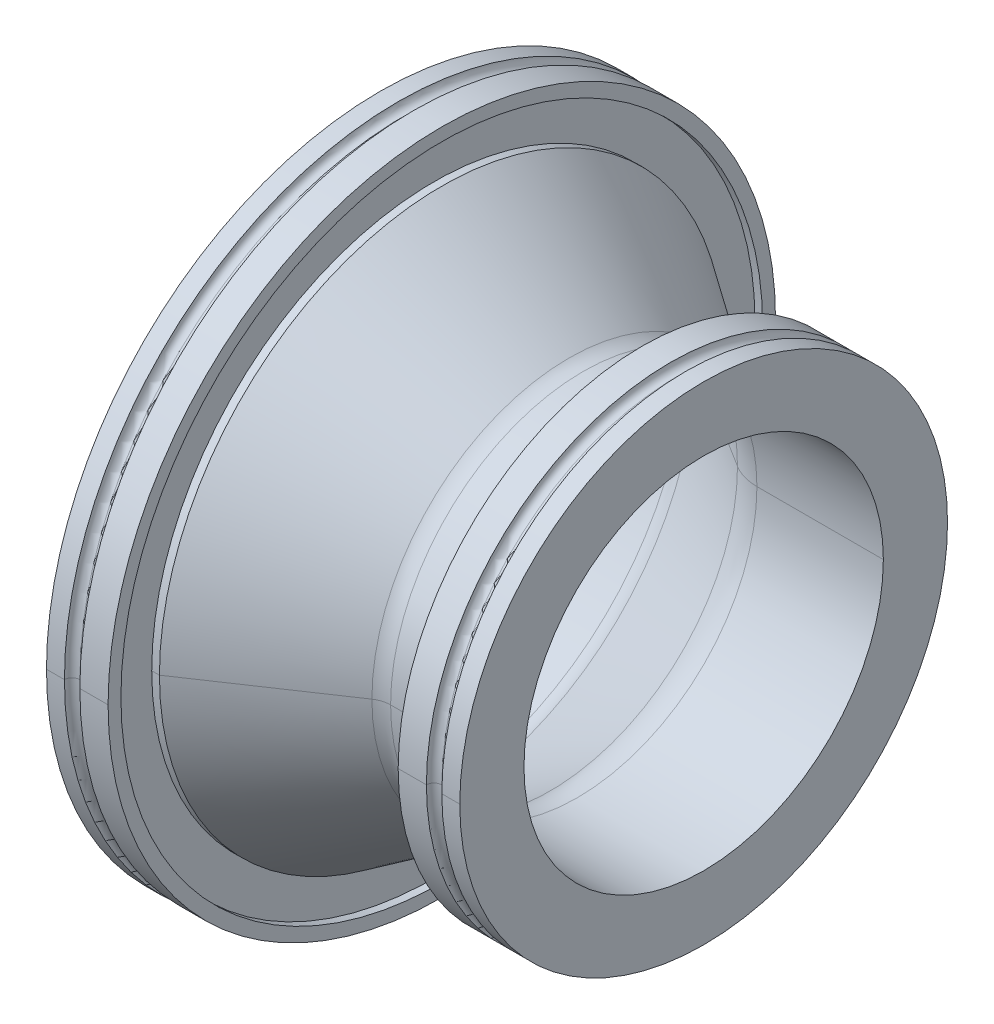
ISO-10303-21;
HEADER;
FILE_DESCRIPTION(('STEP AP214'),'2;1');
FILE_NAME('part.step','',(''),(''),'','','');
FILE_SCHEMA(('AUTOMOTIVE_DESIGN { 1 0 10303 214 1 1 1 1 }'));
ENDSEC;
DATA;
#1=APPLICATION_CONTEXT('core data for automotive mechanical design processes');
#2=APPLICATION_PROTOCOL_DEFINITION('international standard','automotive_design',2000,#1);
#3=PRODUCT_CONTEXT('',#1,'mechanical');
#4=PRODUCT('Part','Part','',(#3));
#5=PRODUCT_RELATED_PRODUCT_CATEGORY('part','',(#4));
#6=PRODUCT_DEFINITION_FORMATION('','',#4);
#7=PRODUCT_DEFINITION_CONTEXT('part definition',#1,'design');
#8=PRODUCT_DEFINITION('design','',#6,#7);
#9=PRODUCT_DEFINITION_SHAPE('','',#8);
#10=(LENGTH_UNIT() NAMED_UNIT(*) SI_UNIT(.MILLI.,.METRE.));
#11=(NAMED_UNIT(*) PLANE_ANGLE_UNIT() SI_UNIT($,.RADIAN.));
#12=(NAMED_UNIT(*) SI_UNIT($,.STERADIAN.) SOLID_ANGLE_UNIT());
#13=UNCERTAINTY_MEASURE_WITH_UNIT(LENGTH_MEASURE(1.E-05),#10,'distance_accuracy_value','');
#14=(GEOMETRIC_REPRESENTATION_CONTEXT(3) GLOBAL_UNCERTAINTY_ASSIGNED_CONTEXT((#13)) GLOBAL_UNIT_ASSIGNED_CONTEXT((#10,
#11,#12)) REPRESENTATION_CONTEXT('',''));
#15=CARTESIAN_POINT('',(0.,0.,0.));
#16=DIRECTION('',(0.,0.,1.));
#17=DIRECTION('',(1.,0.,0.));
#18=AXIS2_PLACEMENT_3D('',#15,#16,#17);
#19=CARTESIAN_POINT('',(11.2187095906382,0.,0.));
#20=DIRECTION('',(-1.,0.,0.));
#21=DIRECTION('',(0.,0.,1.));
#22=AXIS2_PLACEMENT_3D('',#19,#20,#21);
#23=CONICAL_SURFACE('',#22,50.2353194725407,0.560359876904843);
#24=DIRECTION('',(-0.847063894508148,0.,-0.531491071063936));
#25=VECTOR('',#24,1.);
#26=CARTESIAN_POINT('',(11.2187095906382,0.,-50.2353194725407));
#27=LINE('',#26,#25);
#28=CARTESIAN_POINT('',(33.0625808187235,0.,-36.5293610549186));
#29=VERTEX_POINT('',#28);
#30=CARTESIAN_POINT('',(11.2187095906382,0.,-50.2353194725407));
#31=VERTEX_POINT('',#30);
#32=EDGE_CURVE('E405',#29,#31,#27,.T.);
#33=ORIENTED_EDGE('',*,*,#32,.F.);
#34=CARTESIAN_POINT('',(33.0625808187235,0.,0.));
#35=DIRECTION('',(-1.,0.,0.));
#36=DIRECTION('',(0.,0.,1.));
#37=AXIS2_PLACEMENT_3D('',#34,#35,#36);
#38=CIRCLE('',#37,36.5293610549186);
#39=CARTESIAN_POINT('',(33.0625808187235,0.,36.5293610549186));
#40=VERTEX_POINT('',#39);
#41=EDGE_CURVE('E411',#40,#29,#38,.T.);
#42=ORIENTED_EDGE('',*,*,#41,.F.);
#43=DIRECTION('',(-0.847063894508148,0.,0.531491071063936));
#44=VECTOR('',#43,1.);
#45=CARTESIAN_POINT('',(11.2187095906382,0.,50.2353194725407));
#46=LINE('',#45,#44);
#47=CARTESIAN_POINT('',(11.2187095906382,0.,50.2353194725407));
#48=VERTEX_POINT('',#47);
#49=EDGE_CURVE('E21',#40,#48,#46,.T.);
#50=ORIENTED_EDGE('',*,*,#49,.T.);
#51=CARTESIAN_POINT('',(11.2187095906382,0.,0.));
#52=DIRECTION('',(-1.,0.,0.));
#53=DIRECTION('',(0.,0.,1.));
#54=AXIS2_PLACEMENT_3D('',#51,#52,#53);
#55=CIRCLE('',#54,50.2353194725407);
#56=EDGE_CURVE('E11',#48,#31,#55,.T.);
#57=ORIENTED_EDGE('',*,*,#56,.T.);
#58=EDGE_LOOP('',(#33,#42,#50,#57));
#59=FACE_BOUND('',#58,.T.);
#60=ADVANCED_FACE('F17',(#59),#23,.F.);
#61=CARTESIAN_POINT('',(8.56125423531852,0.,0.));
#62=DIRECTION('',(-1.,0.,0.));
#63=DIRECTION('',(0.,0.,1.));
#64=AXIS2_PLACEMENT_3D('',#61,#62,#63);
#65=TOROIDAL_SURFACE('',#64,46.,5.);
#66=CARTESIAN_POINT('',(8.56125423531852,0.,-46.));
#67=DIRECTION('',(0.,1.,0.));
#68=DIRECTION('',(0.,0.,1.));
#69=AXIS2_PLACEMENT_3D('',#66,#67,#68);
#70=CIRCLE('',#69,5.);
#71=CARTESIAN_POINT('',(8.5612542353185,0.,-51.));
#72=VERTEX_POINT('',#71);
#73=EDGE_CURVE('E286',#31,#72,#70,.T.);
#74=ORIENTED_EDGE('',*,*,#73,.F.);
#75=ORIENTED_EDGE('',*,*,#56,.F.);
#76=CARTESIAN_POINT('',(8.56125423531852,0.,46.));
#77=DIRECTION('',(0.,-1.,0.));
#78=DIRECTION('',(0.,0.,-1.));
#79=AXIS2_PLACEMENT_3D('',#76,#77,#78);
#80=CIRCLE('',#79,5.);
#81=CARTESIAN_POINT('',(8.5612542353185,0.,51.));
#82=VERTEX_POINT('',#81);
#83=EDGE_CURVE('E285',#48,#82,#80,.T.);
#84=ORIENTED_EDGE('',*,*,#83,.T.);
#85=CARTESIAN_POINT('',(8.5612542353185,0.,0.));
#86=DIRECTION('',(-1.,0.,0.));
#87=DIRECTION('',(0.,0.,1.));
#88=AXIS2_PLACEMENT_3D('',#85,#86,#87);
#89=CIRCLE('',#88,51.);
#90=EDGE_CURVE('E28',#82,#72,#89,.T.);
#91=ORIENTED_EDGE('',*,*,#90,.T.);
#92=EDGE_LOOP('',(#74,#75,#84,#91));
#93=FACE_BOUND('',#92,.T.);
#94=ADVANCED_FACE('F650',(#93),#65,.F.);
#95=CARTESIAN_POINT('',(0.,0.,0.));
#96=DIRECTION('',(-1.,0.,0.));
#97=DIRECTION('',(0.,0.,1.));
#98=AXIS2_PLACEMENT_3D('',#95,#96,#97);
#99=CYLINDRICAL_SURFACE('',#98,51.);
#100=DIRECTION('',(-1.,0.,0.));
#101=VECTOR('',#100,1.);
#102=CARTESIAN_POINT('',(0.,0.,-51.));
#103=LINE('',#102,#101);
#104=CARTESIAN_POINT('',(0.,0.,-51.));
#105=VERTEX_POINT('',#104);
#106=EDGE_CURVE('E301',#72,#105,#103,.T.);
#107=ORIENTED_EDGE('',*,*,#106,.F.);
#108=ORIENTED_EDGE('',*,*,#90,.F.);
#109=DIRECTION('',(-1.,0.,0.));
#110=VECTOR('',#109,1.);
#111=CARTESIAN_POINT('',(0.,0.,51.));
#112=LINE('',#111,#110);
#113=CARTESIAN_POINT('',(0.,0.,51.));
#114=VERTEX_POINT('',#113);
#115=EDGE_CURVE('E300',#82,#114,#112,.T.);
#116=ORIENTED_EDGE('',*,*,#115,.T.);
#117=CARTESIAN_POINT('',(0.,0.,0.));
#118=DIRECTION('',(-1.,0.,0.));
#119=DIRECTION('',(0.,0.,1.));
#120=AXIS2_PLACEMENT_3D('',#117,#118,#119);
#121=CIRCLE('',#120,51.);
#122=EDGE_CURVE('E421',#114,#105,#121,.T.);
#123=ORIENTED_EDGE('',*,*,#122,.T.);
#124=EDGE_LOOP('',(#107,#108,#116,#123));
#125=FACE_BOUND('',#124,.T.);
#126=ADVANCED_FACE('F518',(#125),#99,.F.);
#127=CARTESIAN_POINT('',(0.,0.,0.));
#128=DIRECTION('',(-1.,0.,0.));
#129=DIRECTION('',(0.,0.,1.));
#130=AXIS2_PLACEMENT_3D('',#127,#128,#129);
#131=PLANE('',#130);
#132=ORIENTED_EDGE('',*,*,#122,.F.);
#133=CARTESIAN_POINT('',(0.,0.,0.));
#134=DIRECTION('',(-1.,0.,0.));
#135=DIRECTION('',(0.,0.,1.));
#136=AXIS2_PLACEMENT_3D('',#133,#134,#135);
#137=CIRCLE('',#136,51.);
#138=EDGE_CURVE('E296',#105,#114,#137,.T.);
#139=ORIENTED_EDGE('',*,*,#138,.F.);
#140=EDGE_LOOP('',(#132,#139));
#141=FACE_BOUND('',#140,.T.);
#142=CARTESIAN_POINT('',(0.,0.,0.));
#143=DIRECTION('',(-1.,0.,0.));
#144=DIRECTION('',(0.,0.,1.));
#145=AXIS2_PLACEMENT_3D('',#142,#143,#144);
#146=CIRCLE('',#145,65.);
#147=CARTESIAN_POINT('',(0.,0.,65.));
#148=VERTEX_POINT('',#147);
#149=CARTESIAN_POINT('',(0.,0.,-65.));
#150=VERTEX_POINT('',#149);
#151=EDGE_CURVE('E528',#148,#150,#146,.T.);
#152=ORIENTED_EDGE('',*,*,#151,.T.);
#153=CARTESIAN_POINT('',(0.,0.,0.));
#154=DIRECTION('',(-1.,0.,0.));
#155=DIRECTION('',(0.,0.,1.));
#156=AXIS2_PLACEMENT_3D('',#153,#154,#155);
#157=CIRCLE('',#156,65.);
#158=EDGE_CURVE('E338',#150,#148,#157,.T.);
#159=ORIENTED_EDGE('',*,*,#158,.T.);
#160=EDGE_LOOP('',(#152,#159));
#161=FACE_BOUND('',#160,.T.);
#162=ADVANCED_FACE('F521',(#141,#161),#131,.T.);
#163=CARTESIAN_POINT('',(0.,0.,0.));
#164=DIRECTION('',(-1.,0.,0.));
#165=DIRECTION('',(0.,0.,1.));
#166=AXIS2_PLACEMENT_3D('',#163,#164,#165);
#167=CYLINDRICAL_SURFACE('',#166,65.);
#168=DIRECTION('',(-1.,0.,0.));
#169=VECTOR('',#168,1.);
#170=CARTESIAN_POINT('',(0.,0.,-65.));
#171=LINE('',#170,#169);
#172=CARTESIAN_POINT('',(3.5,0.,-65.));
#173=VERTEX_POINT('',#172);
#174=EDGE_CURVE('E342',#173,#150,#171,.T.);
#175=ORIENTED_EDGE('',*,*,#174,.F.);
#176=CARTESIAN_POINT('',(3.5,0.,0.));
#177=DIRECTION('',(-1.,0.,0.));
#178=DIRECTION('',(0.,0.,1.));
#179=AXIS2_PLACEMENT_3D('',#176,#177,#178);
#180=CIRCLE('',#179,65.);
#181=CARTESIAN_POINT('',(3.5,0.,65.));
#182=VERTEX_POINT('',#181);
#183=EDGE_CURVE('E446',#173,#182,#180,.T.);
#184=ORIENTED_EDGE('',*,*,#183,.T.);
#185=DIRECTION('',(-1.,0.,0.));
#186=VECTOR('',#185,1.);
#187=CARTESIAN_POINT('',(0.,0.,65.));
#188=LINE('',#187,#186);
#189=EDGE_CURVE('E386',#182,#148,#188,.T.);
#190=ORIENTED_EDGE('',*,*,#189,.T.);
#191=ORIENTED_EDGE('',*,*,#158,.F.);
#192=EDGE_LOOP('',(#175,#184,#190,#191));
#193=FACE_BOUND('',#192,.T.);
#194=ADVANCED_FACE('F524',(#193),#167,.T.);
#195=CARTESIAN_POINT('',(5.,0.,0.));
#196=DIRECTION('',(-1.,0.,0.));
#197=DIRECTION('',(0.,0.,1.));
#198=AXIS2_PLACEMENT_3D('',#195,#196,#197);
#199=TOROIDAL_SURFACE('',#198,65.,1.5);
#200=CARTESIAN_POINT('',(5.,0.,0.));
#201=DIRECTION('',(-1.,0.,0.));
#202=DIRECTION('',(0.,0.,1.));
#203=AXIS2_PLACEMENT_3D('',#200,#201,#202);
#204=CIRCLE('',#203,63.5);
#205=CARTESIAN_POINT('',(5.,0.,63.5));
#206=VERTEX_POINT('',#205);
#207=CARTESIAN_POINT('',(5.,0.,-63.5));
#208=VERTEX_POINT('',#207);
#209=EDGE_CURVE('E287',#206,#208,#204,.T.);
#210=ORIENTED_EDGE('',*,*,#209,.F.);
#211=CARTESIAN_POINT('',(5.,0.,65.));
#212=DIRECTION('',(0.,-1.,0.));
#213=DIRECTION('',(0.,0.,-1.));
#214=AXIS2_PLACEMENT_3D('',#211,#212,#213);
#215=CIRCLE('',#214,1.5);
#216=CARTESIAN_POINT('',(6.5,0.,65.));
#217=VERTEX_POINT('',#216);
#218=EDGE_CURVE('E393',#206,#217,#215,.T.);
#219=ORIENTED_EDGE('',*,*,#218,.T.);
#220=CARTESIAN_POINT('',(6.5,0.,0.));
#221=DIRECTION('',(-1.,0.,0.));
#222=DIRECTION('',(0.,0.,1.));
#223=AXIS2_PLACEMENT_3D('',#220,#221,#222);
#224=CIRCLE('',#223,65.);
#225=CARTESIAN_POINT('',(6.5,0.,-65.));
#226=VERTEX_POINT('',#225);
#227=EDGE_CURVE('E315',#217,#226,#224,.T.);
#228=ORIENTED_EDGE('',*,*,#227,.T.);
#229=CARTESIAN_POINT('',(5.,0.,-65.));
#230=DIRECTION('',(0.,1.,0.));
#231=DIRECTION('',(0.,0.,1.));
#232=AXIS2_PLACEMENT_3D('',#229,#230,#231);
#233=CIRCLE('',#232,1.5);
#234=EDGE_CURVE('E394',#208,#226,#233,.T.);
#235=ORIENTED_EDGE('',*,*,#234,.F.);
#236=EDGE_LOOP('',(#210,#219,#228,#235));
#237=FACE_BOUND('',#236,.T.);
#238=ADVANCED_FACE('F679',(#237),#199,.F.);
#239=CARTESIAN_POINT('',(0.,0.,0.));
#240=DIRECTION('',(-1.,0.,0.));
#241=DIRECTION('',(0.,0.,1.));
#242=AXIS2_PLACEMENT_3D('',#239,#240,#241);
#243=CYLINDRICAL_SURFACE('',#242,65.);
#244=DIRECTION('',(-1.,0.,0.));
#245=VECTOR('',#244,1.);
#246=CARTESIAN_POINT('',(0.,0.,-65.));
#247=LINE('',#246,#245);
#248=CARTESIAN_POINT('',(12.,0.,-65.));
#249=VERTEX_POINT('',#248);
#250=EDGE_CURVE('E345',#249,#226,#247,.T.);
#251=ORIENTED_EDGE('',*,*,#250,.F.);
#252=CARTESIAN_POINT('',(12.,0.,0.));
#253=DIRECTION('',(-1.,0.,0.));
#254=DIRECTION('',(0.,0.,1.));
#255=AXIS2_PLACEMENT_3D('',#252,#253,#254);
#256=CIRCLE('',#255,65.);
#257=CARTESIAN_POINT('',(12.,0.,65.));
#258=VERTEX_POINT('',#257);
#259=EDGE_CURVE('E335',#249,#258,#256,.T.);
#260=ORIENTED_EDGE('',*,*,#259,.T.);
#261=DIRECTION('',(-1.,0.,0.));
#262=VECTOR('',#261,1.);
#263=CARTESIAN_POINT('',(0.,0.,65.));
#264=LINE('',#263,#262);
#265=EDGE_CURVE('E307',#258,#217,#264,.T.);
#266=ORIENTED_EDGE('',*,*,#265,.T.);
#267=CARTESIAN_POINT('',(6.5,0.,0.));
#268=DIRECTION('',(-1.,0.,0.));
#269=DIRECTION('',(0.,0.,1.));
#270=AXIS2_PLACEMENT_3D('',#267,#268,#269);
#271=CIRCLE('',#270,65.);
#272=EDGE_CURVE('E390',#226,#217,#271,.T.);
#273=ORIENTED_EDGE('',*,*,#272,.F.);
#274=EDGE_LOOP('',(#251,#260,#266,#273));
#275=FACE_BOUND('',#274,.T.);
#276=ADVANCED_FACE('F727',(#275),#243,.T.);
#277=CARTESIAN_POINT('',(12.,0.,0.));
#278=DIRECTION('',(1.,0.,0.));
#279=DIRECTION('',(0.,1.,0.));
#280=AXIS2_PLACEMENT_3D('',#277,#278,#279);
#281=PLANE('',#280);
#282=CARTESIAN_POINT('',(12.,0.,0.));
#283=DIRECTION('',(-1.,0.,0.));
#284=DIRECTION('',(0.,0.,1.));
#285=AXIS2_PLACEMENT_3D('',#282,#283,#284);
#286=CIRCLE('',#285,62.5);
#287=CARTESIAN_POINT('',(12.,0.,62.5));
#288=VERTEX_POINT('',#287);
#289=CARTESIAN_POINT('',(12.,0.,-62.5));
#290=VERTEX_POINT('',#289);
#291=EDGE_CURVE('E118',#288,#290,#286,.T.);
#292=ORIENTED_EDGE('',*,*,#291,.T.);
#293=CARTESIAN_POINT('',(12.,0.,0.));
#294=DIRECTION('',(-1.,0.,0.));
#295=DIRECTION('',(0.,0.,1.));
#296=AXIS2_PLACEMENT_3D('',#293,#294,#295);
#297=CIRCLE('',#296,62.5);
#298=EDGE_CURVE('E302',#290,#288,#297,.T.);
#299=ORIENTED_EDGE('',*,*,#298,.T.);
#300=EDGE_LOOP('',(#292,#299));
#301=FACE_BOUND('',#300,.T.);
#302=CARTESIAN_POINT('',(12.,0.,0.));
#303=DIRECTION('',(-1.,0.,0.));
#304=DIRECTION('',(0.,0.,1.));
#305=AXIS2_PLACEMENT_3D('',#302,#303,#304);
#306=CIRCLE('',#305,65.);
#307=EDGE_CURVE('E459',#258,#249,#306,.T.);
#308=ORIENTED_EDGE('',*,*,#307,.F.);
#309=ORIENTED_EDGE('',*,*,#259,.F.);
#310=EDGE_LOOP('',(#308,#309));
#311=FACE_BOUND('',#310,.T.);
#312=ADVANCED_FACE('F730',(#301,#311),#281,.T.);
#313=CARTESIAN_POINT('',(0.,0.,0.));
#314=DIRECTION('',(-1.,0.,0.));
#315=DIRECTION('',(0.,0.,1.));
#316=AXIS2_PLACEMENT_3D('',#313,#314,#315);
#317=CYLINDRICAL_SURFACE('',#316,62.5);
#318=DIRECTION('',(-1.,0.,0.));
#319=VECTOR('',#318,1.);
#320=CARTESIAN_POINT('',(0.,0.,-62.5));
#321=LINE('',#320,#319);
#322=CARTESIAN_POINT('',(10.5,0.,-62.5));
#323=VERTEX_POINT('',#322);
#324=EDGE_CURVE('E306',#290,#323,#321,.T.);
#325=ORIENTED_EDGE('',*,*,#324,.F.);
#326=ORIENTED_EDGE('',*,*,#291,.F.);
#327=DIRECTION('',(-1.,0.,0.));
#328=VECTOR('',#327,1.);
#329=CARTESIAN_POINT('',(0.,0.,62.5));
#330=LINE('',#329,#328);
#331=CARTESIAN_POINT('',(10.5,0.,62.5));
#332=VERTEX_POINT('',#331);
#333=EDGE_CURVE('E478',#288,#332,#330,.T.);
#334=ORIENTED_EDGE('',*,*,#333,.T.);
#335=CARTESIAN_POINT('',(10.5,0.,0.));
#336=DIRECTION('',(-1.,0.,0.));
#337=DIRECTION('',(0.,0.,1.));
#338=AXIS2_PLACEMENT_3D('',#335,#336,#337);
#339=CIRCLE('',#338,62.5);
#340=EDGE_CURVE('E106',#332,#323,#339,.T.);
#341=ORIENTED_EDGE('',*,*,#340,.T.);
#342=EDGE_LOOP('',(#325,#326,#334,#341));
#343=FACE_BOUND('',#342,.T.);
#344=ADVANCED_FACE('F707',(#343),#317,.F.);
#345=CARTESIAN_POINT('',(10.5,0.,0.));
#346=DIRECTION('',(1.,0.,0.));
#347=DIRECTION('',(0.,1.,0.));
#348=AXIS2_PLACEMENT_3D('',#345,#346,#347);
#349=PLANE('',#348);
#350=CARTESIAN_POINT('',(10.5,0.,0.));
#351=DIRECTION('',(-1.,0.,0.));
#352=DIRECTION('',(0.,0.,1.));
#353=AXIS2_PLACEMENT_3D('',#350,#351,#352);
#354=CIRCLE('',#353,55.);
#355=CARTESIAN_POINT('',(10.5,0.,55.));
#356=VERTEX_POINT('',#355);
#357=CARTESIAN_POINT('',(10.5,0.,-55.));
#358=VERTEX_POINT('',#357);
#359=EDGE_CURVE('E312',#356,#358,#354,.T.);
#360=ORIENTED_EDGE('',*,*,#359,.T.);
#361=CARTESIAN_POINT('',(10.5,0.,0.));
#362=DIRECTION('',(-1.,0.,0.));
#363=DIRECTION('',(0.,0.,1.));
#364=AXIS2_PLACEMENT_3D('',#361,#362,#363);
#365=CIRCLE('',#364,55.);
#366=EDGE_CURVE('E418',#358,#356,#365,.T.);
#367=ORIENTED_EDGE('',*,*,#366,.T.);
#368=EDGE_LOOP('',(#360,#367));
#369=FACE_BOUND('',#368,.T.);
#370=ORIENTED_EDGE('',*,*,#340,.F.);
#371=CARTESIAN_POINT('',(10.5,0.,0.));
#372=DIRECTION('',(-1.,0.,0.));
#373=DIRECTION('',(0.,0.,1.));
#374=AXIS2_PLACEMENT_3D('',#371,#372,#373);
#375=CIRCLE('',#374,62.5);
#376=EDGE_CURVE('E436',#323,#332,#375,.T.);
#377=ORIENTED_EDGE('',*,*,#376,.F.);
#378=EDGE_LOOP('',(#370,#377));
#379=FACE_BOUND('',#378,.T.);
#380=ADVANCED_FACE('F672',(#369,#379),#349,.T.);
#381=CARTESIAN_POINT('',(0.,0.,0.));
#382=DIRECTION('',(-1.,0.,0.));
#383=DIRECTION('',(0.,0.,1.));
#384=AXIS2_PLACEMENT_3D('',#381,#382,#383);
#385=CYLINDRICAL_SURFACE('',#384,55.);
#386=DIRECTION('',(-1.,0.,0.));
#387=VECTOR('',#386,1.);
#388=CARTESIAN_POINT('',(0.,0.,-55.));
#389=LINE('',#388,#387);
#390=CARTESIAN_POINT('',(12.,0.,-55.));
#391=VERTEX_POINT('',#390);
#392=EDGE_CURVE('E308',#391,#358,#389,.T.);
#393=ORIENTED_EDGE('',*,*,#392,.F.);
#394=CARTESIAN_POINT('',(12.,0.,0.));
#395=DIRECTION('',(-1.,0.,0.));
#396=DIRECTION('',(0.,0.,1.));
#397=AXIS2_PLACEMENT_3D('',#394,#395,#396);
#398=CIRCLE('',#397,55.);
#399=CARTESIAN_POINT('',(12.,0.,55.));
#400=VERTEX_POINT('',#399);
#401=EDGE_CURVE('E442',#391,#400,#398,.T.);
#402=ORIENTED_EDGE('',*,*,#401,.T.);
#403=DIRECTION('',(-1.,0.,0.));
#404=VECTOR('',#403,1.);
#405=CARTESIAN_POINT('',(0.,0.,55.));
#406=LINE('',#405,#404);
#407=EDGE_CURVE('E280',#400,#356,#406,.T.);
#408=ORIENTED_EDGE('',*,*,#407,.T.);
#409=ORIENTED_EDGE('',*,*,#366,.F.);
#410=EDGE_LOOP('',(#393,#402,#408,#409));
#411=FACE_BOUND('',#410,.T.);
#412=ADVANCED_FACE('F668',(#411),#385,.T.);
#413=CARTESIAN_POINT('',(12.,0.,0.));
#414=DIRECTION('',(-1.,0.,0.));
#415=DIRECTION('',(0.,0.,1.));
#416=AXIS2_PLACEMENT_3D('',#413,#414,#415);
#417=CONICAL_SURFACE('',#416,55.,0.592427353431879);
#418=DIRECTION('',(-0.829587747619415,0.,-0.558376368589991));
#419=VECTOR('',#418,1.);
#420=CARTESIAN_POINT('',(12.,0.,-55.));
#421=LINE('',#420,#419);
#422=CARTESIAN_POINT('',(36.734080410887,0.,-38.352061261903));
#423=VERTEX_POINT('',#422);
#424=EDGE_CURVE('E351',#423,#391,#421,.T.);
#425=ORIENTED_EDGE('',*,*,#424,.F.);
#426=CARTESIAN_POINT('',(36.734080410887,0.,0.));
#427=DIRECTION('',(-1.,0.,0.));
#428=DIRECTION('',(0.,0.,1.));
#429=AXIS2_PLACEMENT_3D('',#426,#427,#428);
#430=CIRCLE('',#429,38.352061261903);
#431=CARTESIAN_POINT('',(36.734080410887,0.,38.352061261903));
#432=VERTEX_POINT('',#431);
#433=EDGE_CURVE('E350',#423,#432,#430,.T.);
#434=ORIENTED_EDGE('',*,*,#433,.T.);
#435=DIRECTION('',(-0.829587747619415,0.,0.558376368589991));
#436=VECTOR('',#435,1.);
#437=CARTESIAN_POINT('',(12.,0.,55.));
#438=LINE('',#437,#436);
#439=EDGE_CURVE('E346',#432,#400,#438,.T.);
#440=ORIENTED_EDGE('',*,*,#439,.T.);
#441=ORIENTED_EDGE('',*,*,#401,.F.);
#442=EDGE_LOOP('',(#425,#434,#440,#441));
#443=FACE_BOUND('',#442,.T.);
#444=ADVANCED_FACE('F671',(#443),#417,.T.);
#445=CARTESIAN_POINT('',(39.5259622538371,0.,0.));
#446=DIRECTION('',(-1.,0.,0.));
#447=DIRECTION('',(0.,0.,1.));
#448=AXIS2_PLACEMENT_3D('',#445,#446,#447);
#449=TOROIDAL_SURFACE('',#448,42.5,5.);
#450=CARTESIAN_POINT('',(39.5259622538371,0.,-42.5));
#451=DIRECTION('',(0.,1.,0.));
#452=DIRECTION('',(0.,0.,1.));
#453=AXIS2_PLACEMENT_3D('',#450,#451,#452);
#454=CIRCLE('',#453,5.);
#455=CARTESIAN_POINT('',(39.5259622538371,0.,-37.5));
#456=VERTEX_POINT('',#455);
#457=EDGE_CURVE('E432',#423,#456,#454,.T.);
#458=ORIENTED_EDGE('',*,*,#457,.F.);
#459=CARTESIAN_POINT('',(36.734080410887,0.,0.));
#460=DIRECTION('',(-1.,0.,0.));
#461=DIRECTION('',(0.,0.,1.));
#462=AXIS2_PLACEMENT_3D('',#459,#460,#461);
#463=CIRCLE('',#462,38.352061261903);
#464=EDGE_CURVE('E425',#432,#423,#463,.T.);
#465=ORIENTED_EDGE('',*,*,#464,.F.);
#466=CARTESIAN_POINT('',(39.5259622538371,0.,42.5));
#467=DIRECTION('',(0.,-1.,0.));
#468=DIRECTION('',(0.,0.,-1.));
#469=AXIS2_PLACEMENT_3D('',#466,#467,#468);
#470=CIRCLE('',#469,5.);
#471=CARTESIAN_POINT('',(39.5259622538371,0.,37.5));
#472=VERTEX_POINT('',#471);
#473=EDGE_CURVE('E352',#432,#472,#470,.T.);
#474=ORIENTED_EDGE('',*,*,#473,.T.);
#475=CARTESIAN_POINT('',(39.5259622538371,0.,0.));
#476=DIRECTION('',(-1.,0.,0.));
#477=DIRECTION('',(0.,0.,1.));
#478=AXIS2_PLACEMENT_3D('',#475,#476,#477);
#479=CIRCLE('',#478,37.5);
#480=EDGE_CURVE('E389',#472,#456,#479,.T.);
#481=ORIENTED_EDGE('',*,*,#480,.T.);
#482=EDGE_LOOP('',(#458,#465,#474,#481));
#483=FACE_BOUND('',#482,.T.);
#484=ADVANCED_FACE('F694',(#483),#449,.F.);
#485=CARTESIAN_POINT('',(0.,0.,0.));
#486=DIRECTION('',(-1.,0.,0.));
#487=DIRECTION('',(0.,0.,1.));
#488=AXIS2_PLACEMENT_3D('',#485,#486,#487);
#489=CYLINDRICAL_SURFACE('',#488,37.5);
#490=DIRECTION('',(-1.,0.,0.));
#491=VECTOR('',#490,1.);
#492=CARTESIAN_POINT('',(0.,0.,-37.5));
#493=LINE('',#492,#491);
#494=CARTESIAN_POINT('',(52.5,0.,-37.5));
#495=VERTEX_POINT('',#494);
#496=EDGE_CURVE('E551',#495,#456,#493,.T.);
#497=ORIENTED_EDGE('',*,*,#496,.F.);
#498=CARTESIAN_POINT('',(52.5,0.,0.));
#499=DIRECTION('',(-1.,0.,0.));
#500=DIRECTION('',(0.,0.,1.));
#501=AXIS2_PLACEMENT_3D('',#498,#499,#500);
#502=CIRCLE('',#501,37.5);
#503=CARTESIAN_POINT('',(52.5,0.,37.5));
#504=VERTEX_POINT('',#503);
#505=EDGE_CURVE('E439',#495,#504,#502,.T.);
#506=ORIENTED_EDGE('',*,*,#505,.T.);
#507=DIRECTION('',(-1.,0.,0.));
#508=VECTOR('',#507,1.);
#509=CARTESIAN_POINT('',(0.,0.,37.5));
#510=LINE('',#509,#508);
#511=EDGE_CURVE('E362',#504,#472,#510,.T.);
#512=ORIENTED_EDGE('',*,*,#511,.T.);
#513=CARTESIAN_POINT('',(39.5259622538371,0.,0.));
#514=DIRECTION('',(-1.,0.,0.));
#515=DIRECTION('',(0.,0.,1.));
#516=AXIS2_PLACEMENT_3D('',#513,#514,#515);
#517=CIRCLE('',#516,37.5);
#518=EDGE_CURVE('E357',#456,#472,#517,.T.);
#519=ORIENTED_EDGE('',*,*,#518,.F.);
#520=EDGE_LOOP('',(#497,#506,#512,#519));
#521=FACE_BOUND('',#520,.T.);
#522=ADVANCED_FACE('F697',(#521),#489,.T.);
#523=CARTESIAN_POINT('',(52.5,0.,0.));
#524=DIRECTION('',(1.,0.,0.));
#525=DIRECTION('',(0.,1.,0.));
#526=AXIS2_PLACEMENT_3D('',#523,#524,#525);
#527=PLANE('',#526);
#528=CARTESIAN_POINT('',(52.5,0.,0.));
#529=DIRECTION('',(-1.,0.,0.));
#530=DIRECTION('',(0.,0.,1.));
#531=AXIS2_PLACEMENT_3D('',#528,#529,#530);
#532=CIRCLE('',#531,37.5);
#533=EDGE_CURVE('E356',#504,#495,#532,.T.);
#534=ORIENTED_EDGE('',*,*,#533,.F.);
#535=ORIENTED_EDGE('',*,*,#505,.F.);
#536=EDGE_LOOP('',(#534,#535));
#537=FACE_BOUND('',#536,.T.);
#538=CARTESIAN_POINT('',(52.5,0.,0.));
#539=DIRECTION('',(-1.,0.,0.));
#540=DIRECTION('',(0.,0.,1.));
#541=AXIS2_PLACEMENT_3D('',#538,#539,#540);
#542=CIRCLE('',#541,45.);
#543=CARTESIAN_POINT('',(52.5,0.,45.));
#544=VERTEX_POINT('',#543);
#545=CARTESIAN_POINT('',(52.5,0.,-45.));
#546=VERTEX_POINT('',#545);
#547=EDGE_CURVE('E424',#544,#546,#542,.T.);
#548=ORIENTED_EDGE('',*,*,#547,.T.);
#549=CARTESIAN_POINT('',(52.5,0.,0.));
#550=DIRECTION('',(-1.,0.,0.));
#551=DIRECTION('',(0.,0.,1.));
#552=AXIS2_PLACEMENT_3D('',#549,#550,#551);
#553=CIRCLE('',#552,45.);
#554=EDGE_CURVE('E358',#546,#544,#553,.T.);
#555=ORIENTED_EDGE('',*,*,#554,.T.);
#556=EDGE_LOOP('',(#548,#555));
#557=FACE_BOUND('',#556,.T.);
#558=ADVANCED_FACE('F684',(#537,#557),#527,.F.);
#559=CARTESIAN_POINT('',(0.,0.,0.));
#560=DIRECTION('',(-1.,0.,0.));
#561=DIRECTION('',(0.,0.,1.));
#562=AXIS2_PLACEMENT_3D('',#559,#560,#561);
#563=CYLINDRICAL_SURFACE('',#562,45.);
#564=DIRECTION('',(-1.,0.,0.));
#565=VECTOR('',#564,1.);
#566=CARTESIAN_POINT('',(0.,0.,-45.));
#567=LINE('',#566,#565);
#568=CARTESIAN_POINT('',(51.,0.,-45.));
#569=VERTEX_POINT('',#568);
#570=EDGE_CURVE('E322',#546,#569,#567,.T.);
#571=ORIENTED_EDGE('',*,*,#570,.F.);
#572=ORIENTED_EDGE('',*,*,#547,.F.);
#573=DIRECTION('',(-1.,0.,0.));
#574=VECTOR('',#573,1.);
#575=CARTESIAN_POINT('',(0.,0.,45.));
#576=LINE('',#575,#574);
#577=CARTESIAN_POINT('',(51.,0.,45.));
#578=VERTEX_POINT('',#577);
#579=EDGE_CURVE('E321',#544,#578,#576,.T.);
#580=ORIENTED_EDGE('',*,*,#579,.T.);
#581=CARTESIAN_POINT('',(51.,0.,0.));
#582=DIRECTION('',(-1.,0.,0.));
#583=DIRECTION('',(0.,0.,1.));
#584=AXIS2_PLACEMENT_3D('',#581,#582,#583);
#585=CIRCLE('',#584,45.);
#586=EDGE_CURVE('E364',#578,#569,#585,.T.);
#587=ORIENTED_EDGE('',*,*,#586,.T.);
#588=EDGE_LOOP('',(#571,#572,#580,#587));
#589=FACE_BOUND('',#588,.T.);
#590=ADVANCED_FACE('F680',(#589),#563,.F.);
#591=CARTESIAN_POINT('',(51.,0.,0.));
#592=DIRECTION('',(1.,0.,0.));
#593=DIRECTION('',(0.,1.,0.));
#594=AXIS2_PLACEMENT_3D('',#591,#592,#593);
#595=PLANE('',#594);
#596=ORIENTED_EDGE('',*,*,#586,.F.);
#597=CARTESIAN_POINT('',(51.,0.,0.));
#598=DIRECTION('',(-1.,0.,0.));
#599=DIRECTION('',(0.,0.,1.));
#600=AXIS2_PLACEMENT_3D('',#597,#598,#599);
#601=CIRCLE('',#600,45.);
#602=EDGE_CURVE('E317',#569,#578,#601,.T.);
#603=ORIENTED_EDGE('',*,*,#602,.F.);
#604=EDGE_LOOP('',(#596,#603));
#605=FACE_BOUND('',#604,.T.);
#606=CARTESIAN_POINT('',(51.,0.,0.));
#607=DIRECTION('',(-1.,0.,0.));
#608=DIRECTION('',(0.,0.,1.));
#609=AXIS2_PLACEMENT_3D('',#606,#607,#608);
#610=CIRCLE('',#609,47.5);
#611=CARTESIAN_POINT('',(51.,0.,47.5));
#612=VERTEX_POINT('',#611);
#613=CARTESIAN_POINT('',(51.,0.,-47.5));
#614=VERTEX_POINT('',#613);
#615=EDGE_CURVE('E329',#612,#614,#610,.T.);
#616=ORIENTED_EDGE('',*,*,#615,.T.);
#617=CARTESIAN_POINT('',(51.,0.,0.));
#618=DIRECTION('',(-1.,0.,0.));
#619=DIRECTION('',(0.,0.,1.));
#620=AXIS2_PLACEMENT_3D('',#617,#618,#619);
#621=CIRCLE('',#620,47.5);
#622=EDGE_CURVE('E295',#614,#612,#621,.T.);
#623=ORIENTED_EDGE('',*,*,#622,.T.);
#624=EDGE_LOOP('',(#616,#623));
#625=FACE_BOUND('',#624,.T.);
#626=ADVANCED_FACE('F683',(#605,#625),#595,.F.);
#627=CARTESIAN_POINT('',(0.,0.,0.));
#628=DIRECTION('',(-1.,0.,0.));
#629=DIRECTION('',(0.,0.,1.));
#630=AXIS2_PLACEMENT_3D('',#627,#628,#629);
#631=CYLINDRICAL_SURFACE('',#630,47.5);
#632=DIRECTION('',(-1.,0.,0.));
#633=VECTOR('',#632,1.);
#634=CARTESIAN_POINT('',(0.,0.,-47.5));
#635=LINE('',#634,#633);
#636=CARTESIAN_POINT('',(56.5,0.,-47.5));
#637=VERTEX_POINT('',#636);
#638=EDGE_CURVE('E334',#637,#614,#635,.T.);
#639=ORIENTED_EDGE('',*,*,#638,.F.);
#640=CARTESIAN_POINT('',(56.5,0.,0.));
#641=DIRECTION('',(-1.,0.,0.));
#642=DIRECTION('',(0.,0.,1.));
#643=AXIS2_PLACEMENT_3D('',#640,#641,#642);
#644=CIRCLE('',#643,47.5);
#645=CARTESIAN_POINT('',(56.5,0.,47.5));
#646=VERTEX_POINT('',#645);
#647=EDGE_CURVE('E447',#637,#646,#644,.T.);
#648=ORIENTED_EDGE('',*,*,#647,.T.);
#649=DIRECTION('',(-1.,0.,0.));
#650=VECTOR('',#649,1.);
#651=CARTESIAN_POINT('',(0.,0.,47.5));
#652=LINE('',#651,#650);
#653=EDGE_CURVE('E333',#646,#612,#652,.T.);
#654=ORIENTED_EDGE('',*,*,#653,.T.);
#655=ORIENTED_EDGE('',*,*,#622,.F.);
#656=EDGE_LOOP('',(#639,#648,#654,#655));
#657=FACE_BOUND('',#656,.T.);
#658=ADVANCED_FACE('F618',(#657),#631,.T.);
#659=CARTESIAN_POINT('',(58.,0.,0.));
#660=DIRECTION('',(-1.,0.,0.));
#661=DIRECTION('',(0.,0.,1.));
#662=AXIS2_PLACEMENT_3D('',#659,#660,#661);
#663=TOROIDAL_SURFACE('',#662,47.5,1.5);
#664=CARTESIAN_POINT('',(58.,0.,0.));
#665=DIRECTION('',(-1.,0.,0.));
#666=DIRECTION('',(0.,0.,1.));
#667=AXIS2_PLACEMENT_3D('',#664,#665,#666);
#668=CIRCLE('',#667,46.);
#669=CARTESIAN_POINT('',(58.,0.,46.));
#670=VERTEX_POINT('',#669);
#671=CARTESIAN_POINT('',(58.,0.,-46.));
#672=VERTEX_POINT('',#671);
#673=EDGE_CURVE('E327',#670,#672,#668,.T.);
#674=ORIENTED_EDGE('',*,*,#673,.F.);
#675=CARTESIAN_POINT('',(58.,0.,47.5));
#676=DIRECTION('',(0.,-1.,0.));
#677=DIRECTION('',(0.,0.,-1.));
#678=AXIS2_PLACEMENT_3D('',#675,#676,#677);
#679=CIRCLE('',#678,1.5);
#680=CARTESIAN_POINT('',(59.5,0.,47.5));
#681=VERTEX_POINT('',#680);
#682=EDGE_CURVE('E501',#670,#681,#679,.T.);
#683=ORIENTED_EDGE('',*,*,#682,.T.);
#684=CARTESIAN_POINT('',(59.5,0.,0.));
#685=DIRECTION('',(-1.,0.,0.));
#686=DIRECTION('',(0.,0.,1.));
#687=AXIS2_PLACEMENT_3D('',#684,#685,#686);
#688=CIRCLE('',#687,47.5);
#689=CARTESIAN_POINT('',(59.5,0.,-47.5));
#690=VERTEX_POINT('',#689);
#691=EDGE_CURVE('E276',#681,#690,#688,.T.);
#692=ORIENTED_EDGE('',*,*,#691,.T.);
#693=CARTESIAN_POINT('',(58.,0.,-47.5));
#694=DIRECTION('',(0.,1.,0.));
#695=DIRECTION('',(0.,0.,1.));
#696=AXIS2_PLACEMENT_3D('',#693,#694,#695);
#697=CIRCLE('',#696,1.5);
#698=EDGE_CURVE('E558',#672,#690,#697,.T.);
#699=ORIENTED_EDGE('',*,*,#698,.F.);
#700=EDGE_LOOP('',(#674,#683,#692,#699));
#701=FACE_BOUND('',#700,.T.);
#702=ADVANCED_FACE('F633',(#701),#663,.F.);
#703=CARTESIAN_POINT('',(0.,0.,0.));
#704=DIRECTION('',(-1.,0.,0.));
#705=DIRECTION('',(0.,0.,1.));
#706=AXIS2_PLACEMENT_3D('',#703,#704,#705);
#707=CYLINDRICAL_SURFACE('',#706,47.5);
#708=DIRECTION('',(-1.,0.,0.));
#709=VECTOR('',#708,1.);
#710=CARTESIAN_POINT('',(0.,0.,-47.5));
#711=LINE('',#710,#709);
#712=CARTESIAN_POINT('',(63.,0.,-47.5));
#713=VERTEX_POINT('',#712);
#714=EDGE_CURVE('E400',#713,#690,#711,.T.);
#715=ORIENTED_EDGE('',*,*,#714,.F.);
#716=CARTESIAN_POINT('',(63.,0.,0.));
#717=DIRECTION('',(-1.,0.,0.));
#718=DIRECTION('',(0.,0.,1.));
#719=AXIS2_PLACEMENT_3D('',#716,#717,#718);
#720=CIRCLE('',#719,47.5);
#721=CARTESIAN_POINT('',(63.,0.,47.5));
#722=VERTEX_POINT('',#721);
#723=EDGE_CURVE('E254',#713,#722,#720,.T.);
#724=ORIENTED_EDGE('',*,*,#723,.T.);
#725=DIRECTION('',(-1.,0.,0.));
#726=VECTOR('',#725,1.);
#727=CARTESIAN_POINT('',(0.,0.,47.5));
#728=LINE('',#727,#726);
#729=EDGE_CURVE('E269',#722,#681,#728,.T.);
#730=ORIENTED_EDGE('',*,*,#729,.T.);
#731=CARTESIAN_POINT('',(59.5,0.,0.));
#732=DIRECTION('',(-1.,0.,0.));
#733=DIRECTION('',(0.,0.,1.));
#734=AXIS2_PLACEMENT_3D('',#731,#732,#733);
#735=CIRCLE('',#734,47.5);
#736=EDGE_CURVE('E566',#690,#681,#735,.T.);
#737=ORIENTED_EDGE('',*,*,#736,.F.);
#738=EDGE_LOOP('',(#715,#724,#730,#737));
#739=FACE_BOUND('',#738,.T.);
#740=ADVANCED_FACE('F718',(#739),#707,.T.);
#741=CARTESIAN_POINT('',(63.,0.,0.));
#742=DIRECTION('',(1.,0.,0.));
#743=DIRECTION('',(0.,1.,0.));
#744=AXIS2_PLACEMENT_3D('',#741,#742,#743);
#745=PLANE('',#744);
#746=CARTESIAN_POINT('',(63.,0.,0.));
#747=DIRECTION('',(-1.,0.,0.));
#748=DIRECTION('',(0.,0.,1.));
#749=AXIS2_PLACEMENT_3D('',#746,#747,#748);
#750=CIRCLE('',#749,35.);
#751=CARTESIAN_POINT('',(63.,0.,35.));
#752=VERTEX_POINT('',#751);
#753=CARTESIAN_POINT('',(63.,0.,-35.));
#754=VERTEX_POINT('',#753);
#755=EDGE_CURVE('E244',#752,#754,#750,.T.);
#756=ORIENTED_EDGE('',*,*,#755,.T.);
#757=CARTESIAN_POINT('',(63.,0.,0.));
#758=DIRECTION('',(-1.,0.,0.));
#759=DIRECTION('',(0.,0.,1.));
#760=AXIS2_PLACEMENT_3D('',#757,#758,#759);
#761=CIRCLE('',#760,35.);
#762=EDGE_CURVE('E249',#754,#752,#761,.T.);
#763=ORIENTED_EDGE('',*,*,#762,.T.);
#764=EDGE_LOOP('',(#756,#763));
#765=FACE_BOUND('',#764,.T.);
#766=CARTESIAN_POINT('',(63.,0.,0.));
#767=DIRECTION('',(-1.,0.,0.));
#768=DIRECTION('',(0.,0.,1.));
#769=AXIS2_PLACEMENT_3D('',#766,#767,#768);
#770=CIRCLE('',#769,47.5);
#771=EDGE_CURVE('E403',#722,#713,#770,.T.);
#772=ORIENTED_EDGE('',*,*,#771,.F.);
#773=ORIENTED_EDGE('',*,*,#723,.F.);
#774=EDGE_LOOP('',(#772,#773));
#775=FACE_BOUND('',#774,.T.);
#776=ADVANCED_FACE('F246',(#765,#775),#745,.T.);
#777=CARTESIAN_POINT('',(0.,0.,0.));
#778=DIRECTION('',(-1.,0.,0.));
#779=DIRECTION('',(0.,0.,1.));
#780=AXIS2_PLACEMENT_3D('',#777,#778,#779);
#781=CYLINDRICAL_SURFACE('',#780,35.);
#782=DIRECTION('',(-1.,0.,0.));
#783=VECTOR('',#782,1.);
#784=CARTESIAN_POINT('',(0.,0.,-35.));
#785=LINE('',#784,#783);
#786=CARTESIAN_POINT('',(38.377491529363,0.,-35.));
#787=VERTEX_POINT('',#786);
#788=EDGE_CURVE('E257',#754,#787,#785,.T.);
#789=ORIENTED_EDGE('',*,*,#788,.F.);
#790=ORIENTED_EDGE('',*,*,#755,.F.);
#791=DIRECTION('',(-1.,0.,0.));
#792=VECTOR('',#791,1.);
#793=CARTESIAN_POINT('',(0.,0.,35.));
#794=LINE('',#793,#792);
#795=CARTESIAN_POINT('',(38.377491529363,0.,35.));
#796=VERTEX_POINT('',#795);
#797=EDGE_CURVE('E267',#752,#796,#794,.T.);
#798=ORIENTED_EDGE('',*,*,#797,.T.);
#799=CARTESIAN_POINT('',(38.377491529363,0.,0.));
#800=DIRECTION('',(-1.,0.,0.));
#801=DIRECTION('',(0.,0.,1.));
#802=AXIS2_PLACEMENT_3D('',#799,#800,#801);
#803=CIRCLE('',#802,35.);
#804=EDGE_CURVE('E259',#796,#787,#803,.T.);
#805=ORIENTED_EDGE('',*,*,#804,.T.);
#806=EDGE_LOOP('',(#789,#790,#798,#805));
#807=FACE_BOUND('',#806,.T.);
#808=ADVANCED_FACE('F258',(#807),#781,.F.);
#809=CARTESIAN_POINT('',(38.3774915293629,0.,0.));
#810=DIRECTION('',(-1.,0.,0.));
#811=DIRECTION('',(0.,0.,1.));
#812=AXIS2_PLACEMENT_3D('',#809,#810,#811);
#813=TOROIDAL_SURFACE('',#812,45.,10.);
#814=CARTESIAN_POINT('',(38.3774915293629,0.,-45.));
#815=DIRECTION('',(0.,1.,0.));
#816=DIRECTION('',(0.,0.,1.));
#817=AXIS2_PLACEMENT_3D('',#814,#815,#816);
#818=CIRCLE('',#817,10.);
#819=EDGE_CURVE('E415',#29,#787,#818,.T.);
#820=ORIENTED_EDGE('',*,*,#819,.F.);
#821=CARTESIAN_POINT('',(33.0625808187235,0.,0.));
#822=DIRECTION('',(-1.,0.,0.));
#823=DIRECTION('',(0.,0.,1.));
#824=AXIS2_PLACEMENT_3D('',#821,#822,#823);
#825=CIRCLE('',#824,36.5293610549186);
#826=EDGE_CURVE('E410',#29,#40,#825,.T.);
#827=ORIENTED_EDGE('',*,*,#826,.T.);
#828=CARTESIAN_POINT('',(38.3774915293629,0.,45.));
#829=DIRECTION('',(0.,-1.,0.));
#830=DIRECTION('',(0.,0.,-1.));
#831=AXIS2_PLACEMENT_3D('',#828,#829,#830);
#832=CIRCLE('',#831,10.);
#833=EDGE_CURVE('E43',#40,#796,#832,.T.);
#834=ORIENTED_EDGE('',*,*,#833,.T.);
#835=CARTESIAN_POINT('',(38.377491529363,0.,0.));
#836=DIRECTION('',(-1.,0.,0.));
#837=DIRECTION('',(0.,0.,1.));
#838=AXIS2_PLACEMENT_3D('',#835,#836,#837);
#839=CIRCLE('',#838,35.);
#840=EDGE_CURVE('E264',#787,#796,#839,.T.);
#841=ORIENTED_EDGE('',*,*,#840,.F.);
#842=EDGE_LOOP('',(#820,#827,#834,#841));
#843=FACE_BOUND('',#842,.T.);
#844=ADVANCED_FACE('F717',(#843),#813,.T.);
#845=CARTESIAN_POINT('',(38.3774915293629,0.,0.));
#846=DIRECTION('',(-1.,0.,0.));
#847=DIRECTION('',(0.,0.,1.));
#848=AXIS2_PLACEMENT_3D('',#845,#846,#847);
#849=TOROIDAL_SURFACE('',#848,45.,10.);
#850=ORIENTED_EDGE('',*,*,#41,.T.);
#851=ORIENTED_EDGE('',*,*,#819,.T.);
#852=ORIENTED_EDGE('',*,*,#804,.F.);
#853=ORIENTED_EDGE('',*,*,#833,.F.);
#854=EDGE_LOOP('',(#850,#851,#852,#853));
#855=FACE_BOUND('',#854,.T.);
#856=ADVANCED_FACE('F19',(#855),#849,.T.);
#857=CARTESIAN_POINT('',(0.,0.,0.));
#858=DIRECTION('',(-1.,0.,0.));
#859=DIRECTION('',(0.,0.,1.));
#860=AXIS2_PLACEMENT_3D('',#857,#858,#859);
#861=CYLINDRICAL_SURFACE('',#860,35.);
#862=ORIENTED_EDGE('',*,*,#762,.F.);
#863=ORIENTED_EDGE('',*,*,#788,.T.);
#864=ORIENTED_EDGE('',*,*,#840,.T.);
#865=ORIENTED_EDGE('',*,*,#797,.F.);
#866=EDGE_LOOP('',(#862,#863,#864,#865));
#867=FACE_BOUND('',#866,.T.);
#868=ADVANCED_FACE('F266',(#867),#861,.F.);
#869=CARTESIAN_POINT('',(0.,0.,0.));
#870=DIRECTION('',(-1.,0.,0.));
#871=DIRECTION('',(0.,0.,1.));
#872=AXIS2_PLACEMENT_3D('',#869,#870,#871);
#873=CYLINDRICAL_SURFACE('',#872,47.5);
#874=ORIENTED_EDGE('',*,*,#771,.T.);
#875=ORIENTED_EDGE('',*,*,#714,.T.);
#876=ORIENTED_EDGE('',*,*,#691,.F.);
#877=ORIENTED_EDGE('',*,*,#729,.F.);
#878=EDGE_LOOP('',(#874,#875,#876,#877));
#879=FACE_BOUND('',#878,.T.);
#880=ADVANCED_FACE('F637',(#879),#873,.T.);
#881=CARTESIAN_POINT('',(58.,0.,0.));
#882=DIRECTION('',(-1.,0.,0.));
#883=DIRECTION('',(0.,0.,1.));
#884=AXIS2_PLACEMENT_3D('',#881,#882,#883);
#885=TOROIDAL_SURFACE('',#884,47.5,1.5);
#886=CARTESIAN_POINT('',(58.,0.,0.));
#887=DIRECTION('',(-1.,0.,0.));
#888=DIRECTION('',(0.,0.,1.));
#889=AXIS2_PLACEMENT_3D('',#886,#887,#888);
#890=CIRCLE('',#889,46.);
#891=EDGE_CURVE('E455',#672,#670,#890,.T.);
#892=ORIENTED_EDGE('',*,*,#891,.F.);
#893=ORIENTED_EDGE('',*,*,#698,.T.);
#894=ORIENTED_EDGE('',*,*,#736,.T.);
#895=ORIENTED_EDGE('',*,*,#682,.F.);
#896=EDGE_LOOP('',(#892,#893,#894,#895));
#897=FACE_BOUND('',#896,.T.);
#898=ADVANCED_FACE('F635',(#897),#885,.F.);
#899=CARTESIAN_POINT('',(0.,0.,0.));
#900=DIRECTION('',(-1.,0.,0.));
#901=DIRECTION('',(0.,0.,1.));
#902=AXIS2_PLACEMENT_3D('',#899,#900,#901);
#903=CYLINDRICAL_SURFACE('',#902,47.5);
#904=CARTESIAN_POINT('',(56.5,0.,0.));
#905=DIRECTION('',(-1.,0.,0.));
#906=DIRECTION('',(0.,0.,1.));
#907=AXIS2_PLACEMENT_3D('',#904,#905,#906);
#908=CIRCLE('',#907,47.5);
#909=EDGE_CURVE('E451',#646,#637,#908,.T.);
#910=ORIENTED_EDGE('',*,*,#909,.T.);
#911=ORIENTED_EDGE('',*,*,#638,.T.);
#912=ORIENTED_EDGE('',*,*,#615,.F.);
#913=ORIENTED_EDGE('',*,*,#653,.F.);
#914=EDGE_LOOP('',(#910,#911,#912,#913));
#915=FACE_BOUND('',#914,.T.);
#916=ADVANCED_FACE('F613',(#915),#903,.T.);
#917=CARTESIAN_POINT('',(0.,0.,0.));
#918=DIRECTION('',(-1.,0.,0.));
#919=DIRECTION('',(0.,0.,1.));
#920=AXIS2_PLACEMENT_3D('',#917,#918,#919);
#921=CYLINDRICAL_SURFACE('',#920,45.);
#922=ORIENTED_EDGE('',*,*,#554,.F.);
#923=ORIENTED_EDGE('',*,*,#570,.T.);
#924=ORIENTED_EDGE('',*,*,#602,.T.);
#925=ORIENTED_EDGE('',*,*,#579,.F.);
#926=EDGE_LOOP('',(#922,#923,#924,#925));
#927=FACE_BOUND('',#926,.T.);
#928=ADVANCED_FACE('F644',(#927),#921,.F.);
#929=CARTESIAN_POINT('',(0.,0.,0.));
#930=DIRECTION('',(-1.,0.,0.));
#931=DIRECTION('',(0.,0.,1.));
#932=AXIS2_PLACEMENT_3D('',#929,#930,#931);
#933=CYLINDRICAL_SURFACE('',#932,37.5);
#934=ORIENTED_EDGE('',*,*,#533,.T.);
#935=ORIENTED_EDGE('',*,*,#496,.T.);
#936=ORIENTED_EDGE('',*,*,#480,.F.);
#937=ORIENTED_EDGE('',*,*,#511,.F.);
#938=EDGE_LOOP('',(#934,#935,#936,#937));
#939=FACE_BOUND('',#938,.T.);
#940=ADVANCED_FACE('F666',(#939),#933,.T.);
#941=CARTESIAN_POINT('',(39.5259622538371,0.,0.));
#942=DIRECTION('',(-1.,0.,0.));
#943=DIRECTION('',(0.,0.,1.));
#944=AXIS2_PLACEMENT_3D('',#941,#942,#943);
#945=TOROIDAL_SURFACE('',#944,42.5,5.);
#946=ORIENTED_EDGE('',*,*,#433,.F.);
#947=ORIENTED_EDGE('',*,*,#457,.T.);
#948=ORIENTED_EDGE('',*,*,#518,.T.);
#949=ORIENTED_EDGE('',*,*,#473,.F.);
#950=EDGE_LOOP('',(#946,#947,#948,#949));
#951=FACE_BOUND('',#950,.T.);
#952=ADVANCED_FACE('F662',(#951),#945,.F.);
#953=CARTESIAN_POINT('',(12.,0.,0.));
#954=DIRECTION('',(-1.,0.,0.));
#955=DIRECTION('',(0.,0.,1.));
#956=AXIS2_PLACEMENT_3D('',#953,#954,#955);
#957=CONICAL_SURFACE('',#956,55.,0.592427353431879);
#958=ORIENTED_EDGE('',*,*,#464,.T.);
#959=ORIENTED_EDGE('',*,*,#424,.T.);
#960=CARTESIAN_POINT('',(12.,0.,0.));
#961=DIRECTION('',(-1.,0.,0.));
#962=DIRECTION('',(0.,0.,1.));
#963=AXIS2_PLACEMENT_3D('',#960,#961,#962);
#964=CIRCLE('',#963,55.);
#965=EDGE_CURVE('E313',#400,#391,#964,.T.);
#966=ORIENTED_EDGE('',*,*,#965,.F.);
#967=ORIENTED_EDGE('',*,*,#439,.F.);
#968=EDGE_LOOP('',(#958,#959,#966,#967));
#969=FACE_BOUND('',#968,.T.);
#970=ADVANCED_FACE('F665',(#969),#957,.T.);
#971=CARTESIAN_POINT('',(0.,0.,0.));
#972=DIRECTION('',(-1.,0.,0.));
#973=DIRECTION('',(0.,0.,1.));
#974=AXIS2_PLACEMENT_3D('',#971,#972,#973);
#975=CYLINDRICAL_SURFACE('',#974,55.);
#976=ORIENTED_EDGE('',*,*,#965,.T.);
#977=ORIENTED_EDGE('',*,*,#392,.T.);
#978=ORIENTED_EDGE('',*,*,#359,.F.);
#979=ORIENTED_EDGE('',*,*,#407,.F.);
#980=EDGE_LOOP('',(#976,#977,#978,#979));
#981=FACE_BOUND('',#980,.T.);
#982=ADVANCED_FACE('F690',(#981),#975,.T.);
#983=CARTESIAN_POINT('',(0.,0.,0.));
#984=DIRECTION('',(-1.,0.,0.));
#985=DIRECTION('',(0.,0.,1.));
#986=AXIS2_PLACEMENT_3D('',#983,#984,#985);
#987=CYLINDRICAL_SURFACE('',#986,62.5);
#988=ORIENTED_EDGE('',*,*,#298,.F.);
#989=ORIENTED_EDGE('',*,*,#324,.T.);
#990=ORIENTED_EDGE('',*,*,#376,.T.);
#991=ORIENTED_EDGE('',*,*,#333,.F.);
#992=EDGE_LOOP('',(#988,#989,#990,#991));
#993=FACE_BOUND('',#992,.T.);
#994=ADVANCED_FACE('F686',(#993),#987,.F.);
#995=CARTESIAN_POINT('',(0.,0.,0.));
#996=DIRECTION('',(-1.,0.,0.));
#997=DIRECTION('',(0.,0.,1.));
#998=AXIS2_PLACEMENT_3D('',#995,#996,#997);
#999=CYLINDRICAL_SURFACE('',#998,65.);
#1000=ORIENTED_EDGE('',*,*,#307,.T.);
#1001=ORIENTED_EDGE('',*,*,#250,.T.);
#1002=ORIENTED_EDGE('',*,*,#227,.F.);
#1003=ORIENTED_EDGE('',*,*,#265,.F.);
#1004=EDGE_LOOP('',(#1000,#1001,#1002,#1003));
#1005=FACE_BOUND('',#1004,.T.);
#1006=ADVANCED_FACE('F689',(#1005),#999,.T.);
#1007=CARTESIAN_POINT('',(5.,0.,0.));
#1008=DIRECTION('',(-1.,0.,0.));
#1009=DIRECTION('',(0.,0.,1.));
#1010=AXIS2_PLACEMENT_3D('',#1007,#1008,#1009);
#1011=TOROIDAL_SURFACE('',#1010,65.,1.5);
#1012=CARTESIAN_POINT('',(5.,0.,0.));
#1013=DIRECTION('',(-1.,0.,0.));
#1014=DIRECTION('',(0.,0.,1.));
#1015=AXIS2_PLACEMENT_3D('',#1012,#1013,#1014);
#1016=CIRCLE('',#1015,63.5);
#1017=EDGE_CURVE('E443',#208,#206,#1016,.T.);
#1018=ORIENTED_EDGE('',*,*,#1017,.F.);
#1019=ORIENTED_EDGE('',*,*,#234,.T.);
#1020=ORIENTED_EDGE('',*,*,#272,.T.);
#1021=ORIENTED_EDGE('',*,*,#218,.F.);
#1022=EDGE_LOOP('',(#1018,#1019,#1020,#1021));
#1023=FACE_BOUND('',#1022,.T.);
#1024=ADVANCED_FACE('F738',(#1023),#1011,.F.);
#1025=CARTESIAN_POINT('',(0.,0.,0.));
#1026=DIRECTION('',(-1.,0.,0.));
#1027=DIRECTION('',(0.,0.,1.));
#1028=AXIS2_PLACEMENT_3D('',#1025,#1026,#1027);
#1029=CYLINDRICAL_SURFACE('',#1028,65.);
#1030=CARTESIAN_POINT('',(3.5,0.,0.));
#1031=DIRECTION('',(-1.,0.,0.));
#1032=DIRECTION('',(0.,0.,1.));
#1033=AXIS2_PLACEMENT_3D('',#1030,#1031,#1032);
#1034=CIRCLE('',#1033,65.);
#1035=EDGE_CURVE('E328',#182,#173,#1034,.T.);
#1036=ORIENTED_EDGE('',*,*,#1035,.T.);
#1037=ORIENTED_EDGE('',*,*,#174,.T.);
#1038=ORIENTED_EDGE('',*,*,#151,.F.);
#1039=ORIENTED_EDGE('',*,*,#189,.F.);
#1040=EDGE_LOOP('',(#1036,#1037,#1038,#1039));
#1041=FACE_BOUND('',#1040,.T.);
#1042=ADVANCED_FACE('F532',(#1041),#1029,.T.);
#1043=CARTESIAN_POINT('',(0.,0.,0.));
#1044=DIRECTION('',(-1.,0.,0.));
#1045=DIRECTION('',(0.,0.,1.));
#1046=AXIS2_PLACEMENT_3D('',#1043,#1044,#1045);
#1047=CYLINDRICAL_SURFACE('',#1046,51.);
#1048=CARTESIAN_POINT('',(8.5612542353185,0.,0.));
#1049=DIRECTION('',(-1.,0.,0.));
#1050=DIRECTION('',(0.,0.,1.));
#1051=AXIS2_PLACEMENT_3D('',#1048,#1049,#1050);
#1052=CIRCLE('',#1051,51.);
#1053=EDGE_CURVE('E282',#72,#82,#1052,.T.);
#1054=ORIENTED_EDGE('',*,*,#1053,.F.);
#1055=ORIENTED_EDGE('',*,*,#106,.T.);
#1056=ORIENTED_EDGE('',*,*,#138,.T.);
#1057=ORIENTED_EDGE('',*,*,#115,.F.);
#1058=EDGE_LOOP('',(#1054,#1055,#1056,#1057));
#1059=FACE_BOUND('',#1058,.T.);
#1060=ADVANCED_FACE('F513',(#1059),#1047,.F.);
#1061=CARTESIAN_POINT('',(8.56125423531852,0.,0.));
#1062=DIRECTION('',(-1.,0.,0.));
#1063=DIRECTION('',(0.,0.,1.));
#1064=AXIS2_PLACEMENT_3D('',#1061,#1062,#1063);
#1065=TOROIDAL_SURFACE('',#1064,46.,5.);
#1066=CARTESIAN_POINT('',(11.2187095906382,0.,0.));
#1067=DIRECTION('',(-1.,0.,0.));
#1068=DIRECTION('',(0.,0.,1.));
#1069=AXIS2_PLACEMENT_3D('',#1066,#1067,#1068);
#1070=CIRCLE('',#1069,50.2353194725407);
#1071=EDGE_CURVE('E409',#31,#48,#1070,.T.);
#1072=ORIENTED_EDGE('',*,*,#1071,.F.);
#1073=ORIENTED_EDGE('',*,*,#73,.T.);
#1074=ORIENTED_EDGE('',*,*,#1053,.T.);
#1075=ORIENTED_EDGE('',*,*,#83,.F.);
#1076=EDGE_LOOP('',(#1072,#1073,#1074,#1075));
#1077=FACE_BOUND('',#1076,.T.);
#1078=ADVANCED_FACE('F726',(#1077),#1065,.F.);
#1079=CARTESIAN_POINT('',(11.2187095906382,0.,0.));
#1080=DIRECTION('',(-1.,0.,0.));
#1081=DIRECTION('',(0.,0.,1.));
#1082=AXIS2_PLACEMENT_3D('',#1079,#1080,#1081);
#1083=CONICAL_SURFACE('',#1082,50.2353194725407,0.560359876904843);
#1084=ORIENTED_EDGE('',*,*,#826,.F.);
#1085=ORIENTED_EDGE('',*,*,#32,.T.);
#1086=ORIENTED_EDGE('',*,*,#1071,.T.);
#1087=ORIENTED_EDGE('',*,*,#49,.F.);
#1088=EDGE_LOOP('',(#1084,#1085,#1086,#1087));
#1089=FACE_BOUND('',#1088,.T.);
#1090=ADVANCED_FACE('F737',(#1089),#1083,.F.);
#1091=CARTESIAN_POINT('',(5.,0.,0.));
#1092=DIRECTION('',(-1.,0.,0.));
#1093=DIRECTION('',(0.,0.,1.));
#1094=AXIS2_PLACEMENT_3D('',#1091,#1092,#1093);
#1095=TOROIDAL_SURFACE('',#1094,65.,1.5);
#1096=CARTESIAN_POINT('',(5.,0.,-65.));
#1097=DIRECTION('',(0.,1.,0.));
#1098=DIRECTION('',(0.,0.,1.));
#1099=AXIS2_PLACEMENT_3D('',#1096,#1097,#1098);
#1100=CIRCLE('',#1099,1.5);
#1101=EDGE_CURVE('E291',#173,#208,#1100,.T.);
#1102=ORIENTED_EDGE('',*,*,#1101,.T.);
#1103=ORIENTED_EDGE('',*,*,#1017,.T.);
#1104=CARTESIAN_POINT('',(5.,0.,65.));
#1105=DIRECTION('',(0.,-1.,0.));
#1106=DIRECTION('',(0.,0.,-1.));
#1107=AXIS2_PLACEMENT_3D('',#1104,#1105,#1106);
#1108=CIRCLE('',#1107,1.5);
#1109=EDGE_CURVE('E292',#182,#206,#1108,.T.);
#1110=ORIENTED_EDGE('',*,*,#1109,.F.);
#1111=ORIENTED_EDGE('',*,*,#183,.F.);
#1112=EDGE_LOOP('',(#1102,#1103,#1110,#1111));
#1113=FACE_BOUND('',#1112,.T.);
#1114=ADVANCED_FACE('F711',(#1113),#1095,.F.);
#1115=CARTESIAN_POINT('',(58.,0.,0.));
#1116=DIRECTION('',(-1.,0.,0.));
#1117=DIRECTION('',(0.,0.,1.));
#1118=AXIS2_PLACEMENT_3D('',#1115,#1116,#1117);
#1119=TOROIDAL_SURFACE('',#1118,47.5,1.5);
#1120=CARTESIAN_POINT('',(58.,0.,-47.5));
#1121=DIRECTION('',(0.,1.,0.));
#1122=DIRECTION('',(0.,0.,1.));
#1123=AXIS2_PLACEMENT_3D('',#1120,#1121,#1122);
#1124=CIRCLE('',#1123,1.5);
#1125=EDGE_CURVE('E399',#637,#672,#1124,.T.);
#1126=ORIENTED_EDGE('',*,*,#1125,.T.);
#1127=ORIENTED_EDGE('',*,*,#891,.T.);
#1128=CARTESIAN_POINT('',(58.,0.,47.5));
#1129=DIRECTION('',(0.,-1.,0.));
#1130=DIRECTION('',(0.,0.,-1.));
#1131=AXIS2_PLACEMENT_3D('',#1128,#1129,#1130);
#1132=CIRCLE('',#1131,1.5);
#1133=EDGE_CURVE('E323',#646,#670,#1132,.T.);
#1134=ORIENTED_EDGE('',*,*,#1133,.F.);
#1135=ORIENTED_EDGE('',*,*,#647,.F.);
#1136=EDGE_LOOP('',(#1126,#1127,#1134,#1135));
#1137=FACE_BOUND('',#1136,.T.);
#1138=ADVANCED_FACE('F621',(#1137),#1119,.F.);
#1139=CARTESIAN_POINT('',(58.,0.,0.));
#1140=DIRECTION('',(-1.,0.,0.));
#1141=DIRECTION('',(0.,0.,1.));
#1142=AXIS2_PLACEMENT_3D('',#1139,#1140,#1141);
#1143=TOROIDAL_SURFACE('',#1142,47.5,1.5);
#1144=ORIENTED_EDGE('',*,*,#1133,.T.);
#1145=ORIENTED_EDGE('',*,*,#673,.T.);
#1146=ORIENTED_EDGE('',*,*,#1125,.F.);
#1147=ORIENTED_EDGE('',*,*,#909,.F.);
#1148=EDGE_LOOP('',(#1144,#1145,#1146,#1147));
#1149=FACE_BOUND('',#1148,.T.);
#1150=ADVANCED_FACE('F624',(#1149),#1143,.F.);
#1151=CARTESIAN_POINT('',(5.,0.,0.));
#1152=DIRECTION('',(-1.,0.,0.));
#1153=DIRECTION('',(0.,0.,1.));
#1154=AXIS2_PLACEMENT_3D('',#1151,#1152,#1153);
#1155=TOROIDAL_SURFACE('',#1154,65.,1.5);
#1156=ORIENTED_EDGE('',*,*,#1109,.T.);
#1157=ORIENTED_EDGE('',*,*,#209,.T.);
#1158=ORIENTED_EDGE('',*,*,#1101,.F.);
#1159=ORIENTED_EDGE('',*,*,#1035,.F.);
#1160=EDGE_LOOP('',(#1156,#1157,#1158,#1159));
#1161=FACE_BOUND('',#1160,.T.);
#1162=ADVANCED_FACE('F751',(#1161),#1155,.F.);
#1163=CLOSED_SHELL('',(#60,#94,#126,#162,#194,#238,#276,#312,#344,#380,#412,#444,#484,#522,#558,
#590,#626,#658,#702,#740,#776,#808,#844,#856,#868,#880,#898,#916,#928,#940,#952,#970,#982,#994,
#1006,#1024,#1042,#1060,#1078,#1090,#1114,#1138,#1150,#1162));
#1164=MANIFOLD_SOLID_BREP('B1',#1163);
#1165=ADVANCED_BREP_SHAPE_REPRESENTATION('',(#18,#1164),#14);
#1166=SHAPE_DEFINITION_REPRESENTATION(#9,#1165);
ENDSEC;
END-ISO-10303-21;
